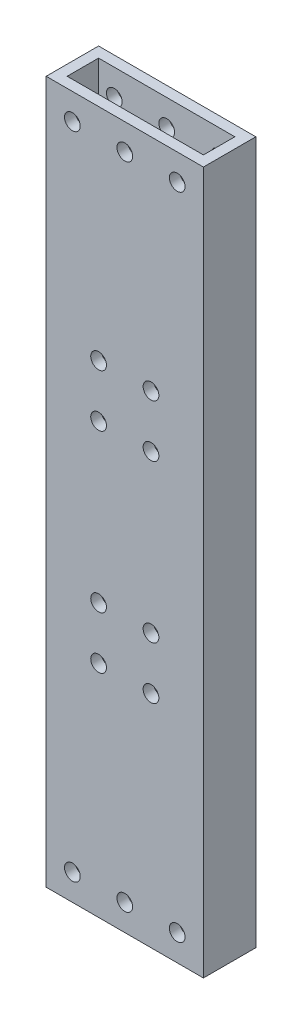
ISO-10303-21;
HEADER;
FILE_DESCRIPTION(('STEP AP214'),'2;1');
FILE_NAME('part.step','',(''),(''),'','','');
FILE_SCHEMA(('AUTOMOTIVE_DESIGN { 1 0 10303 214 1 1 1 1 }'));
ENDSEC;
DATA;
#1=APPLICATION_CONTEXT('core data for automotive mechanical design processes');
#2=APPLICATION_PROTOCOL_DEFINITION('international standard','automotive_design',2000,#1);
#3=PRODUCT_CONTEXT('',#1,'mechanical');
#4=PRODUCT('Part','Part','',(#3));
#5=PRODUCT_RELATED_PRODUCT_CATEGORY('part','',(#4));
#6=PRODUCT_DEFINITION_FORMATION('','',#4);
#7=PRODUCT_DEFINITION_CONTEXT('part definition',#1,'design');
#8=PRODUCT_DEFINITION('design','',#6,#7);
#9=PRODUCT_DEFINITION_SHAPE('','',#8);
#10=(LENGTH_UNIT() NAMED_UNIT(*) SI_UNIT(.MILLI.,.METRE.));
#11=(NAMED_UNIT(*) PLANE_ANGLE_UNIT() SI_UNIT($,.RADIAN.));
#12=(NAMED_UNIT(*) SI_UNIT($,.STERADIAN.) SOLID_ANGLE_UNIT());
#13=UNCERTAINTY_MEASURE_WITH_UNIT(LENGTH_MEASURE(1.E-05),#10,'distance_accuracy_value','');
#14=(GEOMETRIC_REPRESENTATION_CONTEXT(3) GLOBAL_UNCERTAINTY_ASSIGNED_CONTEXT((#13)) GLOBAL_UNIT_ASSIGNED_CONTEXT((#10,
#11,#12)) REPRESENTATION_CONTEXT('',''));
#15=CARTESIAN_POINT('',(0.,0.,0.));
#16=DIRECTION('',(0.,0.,1.));
#17=DIRECTION('',(1.,0.,0.));
#18=AXIS2_PLACEMENT_3D('',#15,#16,#17);
#19=CARTESIAN_POINT('',(0.,67.,0.));
#20=DIRECTION('',(0.,1.,0.));
#21=DIRECTION('',(0.,0.,1.));
#22=AXIS2_PLACEMENT_3D('',#19,#20,#21);
#23=PLANE('',#22);
#24=DIRECTION('',(0.,0.,-1.));
#25=VECTOR('',#24,1.);
#26=CARTESIAN_POINT('',(15.,67.,-5.));
#27=LINE('',#26,#25);
#28=CARTESIAN_POINT('',(15.,67.,5.));
#29=VERTEX_POINT('',#28);
#30=CARTESIAN_POINT('',(15.,67.,-5.));
#31=VERTEX_POINT('',#30);
#32=EDGE_CURVE('E140',#29,#31,#27,.T.);
#33=ORIENTED_EDGE('',*,*,#32,.T.);
#34=DIRECTION('',(-1.,0.,0.));
#35=VECTOR('',#34,1.);
#36=CARTESIAN_POINT('',(-15.,67.,-5.));
#37=LINE('',#36,#35);
#38=CARTESIAN_POINT('',(-15.,67.,-5.));
#39=VERTEX_POINT('',#38);
#40=EDGE_CURVE('E143',#31,#39,#37,.T.);
#41=ORIENTED_EDGE('',*,*,#40,.T.);
#42=DIRECTION('',(0.,0.,1.));
#43=VECTOR('',#42,1.);
#44=CARTESIAN_POINT('',(-15.,67.,-5.));
#45=LINE('',#44,#43);
#46=CARTESIAN_POINT('',(-15.,67.,5.));
#47=VERTEX_POINT('',#46);
#48=EDGE_CURVE('E146',#39,#47,#45,.T.);
#49=ORIENTED_EDGE('',*,*,#48,.T.);
#50=DIRECTION('',(1.,0.,0.));
#51=VECTOR('',#50,1.);
#52=CARTESIAN_POINT('',(-15.,67.,5.));
#53=LINE('',#52,#51);
#54=EDGE_CURVE('E148',#47,#29,#53,.T.);
#55=ORIENTED_EDGE('',*,*,#54,.T.);
#56=EDGE_LOOP('',(#33,#41,#49,#55));
#57=FACE_BOUND('',#56,.T.);
#58=DIRECTION('',(-1.,0.,0.));
#59=VECTOR('',#58,1.);
#60=CARTESIAN_POINT('',(-13.,67.,-3.));
#61=LINE('',#60,#59);
#62=CARTESIAN_POINT('',(13.,67.,-3.));
#63=VERTEX_POINT('',#62);
#64=CARTESIAN_POINT('',(-13.,67.,-3.));
#65=VERTEX_POINT('',#64);
#66=EDGE_CURVE('E110',#63,#65,#61,.T.);
#67=ORIENTED_EDGE('',*,*,#66,.F.);
#68=DIRECTION('',(0.,0.,-1.));
#69=VECTOR('',#68,1.);
#70=CARTESIAN_POINT('',(13.,67.,-3.));
#71=LINE('',#70,#69);
#72=CARTESIAN_POINT('',(13.,67.,3.));
#73=VERTEX_POINT('',#72);
#74=EDGE_CURVE('E102',#73,#63,#71,.T.);
#75=ORIENTED_EDGE('',*,*,#74,.F.);
#76=DIRECTION('',(1.,0.,0.));
#77=VECTOR('',#76,1.);
#78=CARTESIAN_POINT('',(-13.,67.,3.));
#79=LINE('',#78,#77);
#80=CARTESIAN_POINT('',(-13.,67.,3.));
#81=VERTEX_POINT('',#80);
#82=EDGE_CURVE('E124',#81,#73,#79,.T.);
#83=ORIENTED_EDGE('',*,*,#82,.F.);
#84=DIRECTION('',(0.,0.,1.));
#85=VECTOR('',#84,1.);
#86=CARTESIAN_POINT('',(-13.,67.,-3.));
#87=LINE('',#86,#85);
#88=EDGE_CURVE('E122',#65,#81,#87,.T.);
#89=ORIENTED_EDGE('',*,*,#88,.F.);
#90=EDGE_LOOP('',(#67,#75,#83,#89));
#91=FACE_BOUND('',#90,.T.);
#92=ADVANCED_FACE('F35',(#57,#91),#23,.T.);
#93=CARTESIAN_POINT('',(0.,-67.,0.));
#94=DIRECTION('',(0.,1.,0.));
#95=DIRECTION('',(0.,0.,1.));
#96=AXIS2_PLACEMENT_3D('',#93,#94,#95);
#97=PLANE('',#96);
#98=DIRECTION('',(0.,0.,-1.));
#99=VECTOR('',#98,1.);
#100=CARTESIAN_POINT('',(15.,-67.,-5.));
#101=LINE('',#100,#99);
#102=CARTESIAN_POINT('',(15.,-67.,5.));
#103=VERTEX_POINT('',#102);
#104=CARTESIAN_POINT('',(15.,-67.,-5.));
#105=VERTEX_POINT('',#104);
#106=EDGE_CURVE('E118',#103,#105,#101,.T.);
#107=ORIENTED_EDGE('',*,*,#106,.F.);
#108=DIRECTION('',(1.,0.,0.));
#109=VECTOR('',#108,1.);
#110=CARTESIAN_POINT('',(-15.,-67.,5.));
#111=LINE('',#110,#109);
#112=CARTESIAN_POINT('',(-15.,-67.,5.));
#113=VERTEX_POINT('',#112);
#114=EDGE_CURVE('E144',#113,#103,#111,.T.);
#115=ORIENTED_EDGE('',*,*,#114,.F.);
#116=DIRECTION('',(0.,0.,1.));
#117=VECTOR('',#116,1.);
#118=CARTESIAN_POINT('',(-15.,-67.,-5.));
#119=LINE('',#118,#117);
#120=CARTESIAN_POINT('',(-15.,-67.,-5.));
#121=VERTEX_POINT('',#120);
#122=EDGE_CURVE('E155',#121,#113,#119,.T.);
#123=ORIENTED_EDGE('',*,*,#122,.F.);
#124=DIRECTION('',(-1.,0.,0.));
#125=VECTOR('',#124,1.);
#126=CARTESIAN_POINT('',(-15.,-67.,-5.));
#127=LINE('',#126,#125);
#128=EDGE_CURVE('E153',#105,#121,#127,.T.);
#129=ORIENTED_EDGE('',*,*,#128,.F.);
#130=EDGE_LOOP('',(#107,#115,#123,#129));
#131=FACE_BOUND('',#130,.T.);
#132=DIRECTION('',(0.,0.,-1.));
#133=VECTOR('',#132,1.);
#134=CARTESIAN_POINT('',(13.,-67.,-3.));
#135=LINE('',#134,#133);
#136=CARTESIAN_POINT('',(13.,-67.,3.));
#137=VERTEX_POINT('',#136);
#138=CARTESIAN_POINT('',(13.,-67.,-3.));
#139=VERTEX_POINT('',#138);
#140=EDGE_CURVE('E60',#137,#139,#135,.T.);
#141=ORIENTED_EDGE('',*,*,#140,.T.);
#142=DIRECTION('',(-1.,0.,0.));
#143=VECTOR('',#142,1.);
#144=CARTESIAN_POINT('',(-13.,-67.,-3.));
#145=LINE('',#144,#143);
#146=CARTESIAN_POINT('',(-13.,-67.,-3.));
#147=VERTEX_POINT('',#146);
#148=EDGE_CURVE('E117',#139,#147,#145,.T.);
#149=ORIENTED_EDGE('',*,*,#148,.T.);
#150=DIRECTION('',(0.,0.,1.));
#151=VECTOR('',#150,1.);
#152=CARTESIAN_POINT('',(-13.,-67.,-3.));
#153=LINE('',#152,#151);
#154=CARTESIAN_POINT('',(-13.,-67.,3.));
#155=VERTEX_POINT('',#154);
#156=EDGE_CURVE('E132',#147,#155,#153,.T.);
#157=ORIENTED_EDGE('',*,*,#156,.T.);
#158=DIRECTION('',(1.,0.,0.));
#159=VECTOR('',#158,1.);
#160=CARTESIAN_POINT('',(-13.,-67.,3.));
#161=LINE('',#160,#159);
#162=EDGE_CURVE('E111',#155,#137,#161,.T.);
#163=ORIENTED_EDGE('',*,*,#162,.T.);
#164=EDGE_LOOP('',(#141,#149,#157,#163));
#165=FACE_BOUND('',#164,.T.);
#166=ADVANCED_FACE('F267',(#131,#165),#97,.F.);
#167=CARTESIAN_POINT('',(15.,67.,-5.));
#168=DIRECTION('',(-1.,0.,0.));
#169=DIRECTION('',(0.,0.,1.));
#170=AXIS2_PLACEMENT_3D('',#167,#168,#169);
#171=PLANE('',#170);
#172=ORIENTED_EDGE('',*,*,#106,.T.);
#173=DIRECTION('',(0.,-1.,0.));
#174=VECTOR('',#173,1.);
#175=CARTESIAN_POINT('',(15.,67.,-5.));
#176=LINE('',#175,#174);
#177=EDGE_CURVE('E11',#31,#105,#176,.T.);
#178=ORIENTED_EDGE('',*,*,#177,.F.);
#179=ORIENTED_EDGE('',*,*,#32,.F.);
#180=DIRECTION('',(0.,-1.,0.));
#181=VECTOR('',#180,1.);
#182=CARTESIAN_POINT('',(15.,67.,5.));
#183=LINE('',#182,#181);
#184=EDGE_CURVE('E150',#29,#103,#183,.T.);
#185=ORIENTED_EDGE('',*,*,#184,.T.);
#186=EDGE_LOOP('',(#172,#178,#179,#185));
#187=FACE_BOUND('',#186,.T.);
#188=ADVANCED_FACE('F37',(#187),#171,.F.);
#189=CARTESIAN_POINT('',(-15.,67.,-5.));
#190=DIRECTION('',(0.,0.,1.));
#191=DIRECTION('',(1.,0.,0.));
#192=AXIS2_PLACEMENT_3D('',#189,#190,#191);
#193=PLANE('',#192);
#194=CARTESIAN_POINT('',(10.,-62.,-5.));
#195=DIRECTION('',(0.,0.,1.));
#196=DIRECTION('',(-1.,0.,0.));
#197=AXIS2_PLACEMENT_3D('',#194,#195,#196);
#198=CIRCLE('',#197,1.5);
#199=CARTESIAN_POINT('',(8.5,-62.,-5.));
#200=VERTEX_POINT('',#199);
#201=EDGE_CURVE('E303',#200,#200,#198,.T.);
#202=ORIENTED_EDGE('',*,*,#201,.T.);
#203=EDGE_LOOP('',(#202));
#204=FACE_BOUND('',#203,.T.);
#205=CARTESIAN_POINT('',(0.,-62.,-5.));
#206=DIRECTION('',(0.,0.,1.));
#207=DIRECTION('',(-1.,0.,0.));
#208=AXIS2_PLACEMENT_3D('',#205,#206,#207);
#209=CIRCLE('',#208,1.5);
#210=CARTESIAN_POINT('',(-1.5,-62.,-5.));
#211=VERTEX_POINT('',#210);
#212=EDGE_CURVE('E307',#211,#211,#209,.T.);
#213=ORIENTED_EDGE('',*,*,#212,.T.);
#214=EDGE_LOOP('',(#213));
#215=FACE_BOUND('',#214,.T.);
#216=CARTESIAN_POINT('',(-10.,-62.,-5.));
#217=DIRECTION('',(0.,0.,1.));
#218=DIRECTION('',(-1.,0.,0.));
#219=AXIS2_PLACEMENT_3D('',#216,#217,#218);
#220=CIRCLE('',#219,1.5);
#221=CARTESIAN_POINT('',(-11.5,-62.,-5.));
#222=VERTEX_POINT('',#221);
#223=EDGE_CURVE('E311',#222,#222,#220,.T.);
#224=ORIENTED_EDGE('',*,*,#223,.T.);
#225=EDGE_LOOP('',(#224));
#226=FACE_BOUND('',#225,.T.);
#227=CARTESIAN_POINT('',(-5.,-24.9999999999997,-5.));
#228=DIRECTION('',(0.,0.,1.));
#229=DIRECTION('',(-1.,0.,0.));
#230=AXIS2_PLACEMENT_3D('',#227,#228,#229);
#231=CIRCLE('',#230,1.5);
#232=CARTESIAN_POINT('',(-6.5,-24.9999999999997,-5.));
#233=VERTEX_POINT('',#232);
#234=EDGE_CURVE('E315',#233,#233,#231,.T.);
#235=ORIENTED_EDGE('',*,*,#234,.T.);
#236=EDGE_LOOP('',(#235));
#237=FACE_BOUND('',#236,.T.);
#238=CARTESIAN_POINT('',(5.,-24.9999999999997,-5.));
#239=DIRECTION('',(0.,0.,1.));
#240=DIRECTION('',(-1.,0.,0.));
#241=AXIS2_PLACEMENT_3D('',#238,#239,#240);
#242=CIRCLE('',#241,1.5);
#243=CARTESIAN_POINT('',(3.5,-24.9999999999997,-5.));
#244=VERTEX_POINT('',#243);
#245=EDGE_CURVE('E319',#244,#244,#242,.T.);
#246=ORIENTED_EDGE('',*,*,#245,.T.);
#247=EDGE_LOOP('',(#246));
#248=FACE_BOUND('',#247,.T.);
#249=CARTESIAN_POINT('',(0.,62.,-5.));
#250=DIRECTION('',(0.,0.,1.));
#251=DIRECTION('',(1.,0.,0.));
#252=AXIS2_PLACEMENT_3D('',#249,#250,#251);
#253=CIRCLE('',#252,1.5);
#254=CARTESIAN_POINT('',(1.5,62.,-5.));
#255=VERTEX_POINT('',#254);
#256=EDGE_CURVE('E323',#255,#255,#253,.T.);
#257=ORIENTED_EDGE('',*,*,#256,.T.);
#258=EDGE_LOOP('',(#257));
#259=FACE_BOUND('',#258,.T.);
#260=CARTESIAN_POINT('',(10.,62.,-5.));
#261=DIRECTION('',(0.,0.,1.));
#262=DIRECTION('',(1.,0.,0.));
#263=AXIS2_PLACEMENT_3D('',#260,#261,#262);
#264=CIRCLE('',#263,1.5);
#265=CARTESIAN_POINT('',(11.5,62.,-5.));
#266=VERTEX_POINT('',#265);
#267=EDGE_CURVE('E327',#266,#266,#264,.T.);
#268=ORIENTED_EDGE('',*,*,#267,.T.);
#269=EDGE_LOOP('',(#268));
#270=FACE_BOUND('',#269,.T.);
#271=CARTESIAN_POINT('',(-5.,24.9999999999997,-5.));
#272=DIRECTION('',(0.,0.,1.));
#273=DIRECTION('',(1.,0.,0.));
#274=AXIS2_PLACEMENT_3D('',#271,#272,#273);
#275=CIRCLE('',#274,1.5);
#276=CARTESIAN_POINT('',(-3.5,24.9999999999997,-5.));
#277=VERTEX_POINT('',#276);
#278=EDGE_CURVE('E331',#277,#277,#275,.T.);
#279=ORIENTED_EDGE('',*,*,#278,.T.);
#280=EDGE_LOOP('',(#279));
#281=FACE_BOUND('',#280,.T.);
#282=CARTESIAN_POINT('',(-5.,14.9999999999997,-5.));
#283=DIRECTION('',(0.,0.,1.));
#284=DIRECTION('',(1.,0.,0.));
#285=AXIS2_PLACEMENT_3D('',#282,#283,#284);
#286=CIRCLE('',#285,1.5);
#287=CARTESIAN_POINT('',(-3.5,14.9999999999997,-5.));
#288=VERTEX_POINT('',#287);
#289=EDGE_CURVE('E335',#288,#288,#286,.T.);
#290=ORIENTED_EDGE('',*,*,#289,.T.);
#291=EDGE_LOOP('',(#290));
#292=FACE_BOUND('',#291,.T.);
#293=CARTESIAN_POINT('',(5.,14.9999999999997,-5.));
#294=DIRECTION('',(0.,0.,1.));
#295=DIRECTION('',(1.,0.,0.));
#296=AXIS2_PLACEMENT_3D('',#293,#294,#295);
#297=CIRCLE('',#296,1.5);
#298=CARTESIAN_POINT('',(6.5,14.9999999999997,-5.));
#299=VERTEX_POINT('',#298);
#300=EDGE_CURVE('E339',#299,#299,#297,.T.);
#301=ORIENTED_EDGE('',*,*,#300,.T.);
#302=EDGE_LOOP('',(#301));
#303=FACE_BOUND('',#302,.T.);
#304=CARTESIAN_POINT('',(5.,24.9999999999997,-5.));
#305=DIRECTION('',(0.,0.,1.));
#306=DIRECTION('',(1.,0.,0.));
#307=AXIS2_PLACEMENT_3D('',#304,#305,#306);
#308=CIRCLE('',#307,1.5);
#309=CARTESIAN_POINT('',(6.5,24.9999999999997,-5.));
#310=VERTEX_POINT('',#309);
#311=EDGE_CURVE('E343',#310,#310,#308,.T.);
#312=ORIENTED_EDGE('',*,*,#311,.T.);
#313=EDGE_LOOP('',(#312));
#314=FACE_BOUND('',#313,.T.);
#315=CARTESIAN_POINT('',(-5.,-14.9999999999997,-5.));
#316=DIRECTION('',(0.,0.,1.));
#317=DIRECTION('',(-1.,0.,0.));
#318=AXIS2_PLACEMENT_3D('',#315,#316,#317);
#319=CIRCLE('',#318,1.5);
#320=CARTESIAN_POINT('',(-6.5,-14.9999999999997,-5.));
#321=VERTEX_POINT('',#320);
#322=EDGE_CURVE('E347',#321,#321,#319,.T.);
#323=ORIENTED_EDGE('',*,*,#322,.T.);
#324=EDGE_LOOP('',(#323));
#325=FACE_BOUND('',#324,.T.);
#326=CARTESIAN_POINT('',(5.,-14.9999999999997,-5.));
#327=DIRECTION('',(0.,0.,1.));
#328=DIRECTION('',(-1.,0.,0.));
#329=AXIS2_PLACEMENT_3D('',#326,#327,#328);
#330=CIRCLE('',#329,1.5);
#331=CARTESIAN_POINT('',(3.5,-14.9999999999997,-5.));
#332=VERTEX_POINT('',#331);
#333=EDGE_CURVE('E351',#332,#332,#330,.T.);
#334=ORIENTED_EDGE('',*,*,#333,.T.);
#335=EDGE_LOOP('',(#334));
#336=FACE_BOUND('',#335,.T.);
#337=CARTESIAN_POINT('',(-10.,62.,-5.));
#338=DIRECTION('',(0.,0.,1.));
#339=DIRECTION('',(1.,0.,0.));
#340=AXIS2_PLACEMENT_3D('',#337,#338,#339);
#341=CIRCLE('',#340,1.5);
#342=CARTESIAN_POINT('',(-8.5,62.,-5.));
#343=VERTEX_POINT('',#342);
#344=EDGE_CURVE('E169',#343,#343,#341,.T.);
#345=ORIENTED_EDGE('',*,*,#344,.T.);
#346=EDGE_LOOP('',(#345));
#347=FACE_BOUND('',#346,.T.);
#348=ORIENTED_EDGE('',*,*,#128,.T.);
#349=DIRECTION('',(0.,-1.,0.));
#350=VECTOR('',#349,1.);
#351=CARTESIAN_POINT('',(-15.,67.,-5.));
#352=LINE('',#351,#350);
#353=EDGE_CURVE('E44',#39,#121,#352,.T.);
#354=ORIENTED_EDGE('',*,*,#353,.F.);
#355=ORIENTED_EDGE('',*,*,#40,.F.);
#356=ORIENTED_EDGE('',*,*,#177,.T.);
#357=EDGE_LOOP('',(#348,#354,#355,#356));
#358=FACE_BOUND('',#357,.T.);
#359=ADVANCED_FACE('F292',(#204,#215,#226,#237,#248,#259,#270,#281,#292,#303,#314,#325,#336,
#347,#358),#193,.F.);
#360=CARTESIAN_POINT('',(-15.,67.,-5.));
#361=DIRECTION('',(1.,0.,0.));
#362=DIRECTION('',(0.,0.,-1.));
#363=AXIS2_PLACEMENT_3D('',#360,#361,#362);
#364=PLANE('',#363);
#365=ORIENTED_EDGE('',*,*,#122,.T.);
#366=DIRECTION('',(0.,-1.,0.));
#367=VECTOR('',#366,1.);
#368=CARTESIAN_POINT('',(-15.,67.,5.));
#369=LINE('',#368,#367);
#370=EDGE_CURVE('E160',#47,#113,#369,.T.);
#371=ORIENTED_EDGE('',*,*,#370,.F.);
#372=ORIENTED_EDGE('',*,*,#48,.F.);
#373=ORIENTED_EDGE('',*,*,#353,.T.);
#374=EDGE_LOOP('',(#365,#371,#372,#373));
#375=FACE_BOUND('',#374,.T.);
#376=ADVANCED_FACE('F289',(#375),#364,.F.);
#377=CARTESIAN_POINT('',(-15.,67.,5.));
#378=DIRECTION('',(0.,0.,-1.));
#379=DIRECTION('',(-1.,0.,0.));
#380=AXIS2_PLACEMENT_3D('',#377,#378,#379);
#381=PLANE('',#380);
#382=CARTESIAN_POINT('',(10.,-62.,5.));
#383=DIRECTION('',(0.,0.,1.));
#384=DIRECTION('',(-1.,0.,0.));
#385=AXIS2_PLACEMENT_3D('',#382,#383,#384);
#386=CIRCLE('',#385,1.5);
#387=CARTESIAN_POINT('',(8.5,-62.,5.));
#388=VERTEX_POINT('',#387);
#389=EDGE_CURVE('E372',#388,#388,#386,.T.);
#390=ORIENTED_EDGE('',*,*,#389,.F.);
#391=EDGE_LOOP('',(#390));
#392=FACE_BOUND('',#391,.T.);
#393=CARTESIAN_POINT('',(0.,-62.,5.));
#394=DIRECTION('',(0.,0.,1.));
#395=DIRECTION('',(-1.,0.,0.));
#396=AXIS2_PLACEMENT_3D('',#393,#394,#395);
#397=CIRCLE('',#396,1.5);
#398=CARTESIAN_POINT('',(-1.5,-62.,5.));
#399=VERTEX_POINT('',#398);
#400=EDGE_CURVE('E500',#399,#399,#397,.T.);
#401=ORIENTED_EDGE('',*,*,#400,.F.);
#402=EDGE_LOOP('',(#401));
#403=FACE_BOUND('',#402,.T.);
#404=CARTESIAN_POINT('',(-10.,-62.,5.));
#405=DIRECTION('',(0.,0.,1.));
#406=DIRECTION('',(-1.,0.,0.));
#407=AXIS2_PLACEMENT_3D('',#404,#405,#406);
#408=CIRCLE('',#407,1.5);
#409=CARTESIAN_POINT('',(-11.5,-62.,5.));
#410=VERTEX_POINT('',#409);
#411=EDGE_CURVE('E499',#410,#410,#408,.T.);
#412=ORIENTED_EDGE('',*,*,#411,.F.);
#413=EDGE_LOOP('',(#412));
#414=FACE_BOUND('',#413,.T.);
#415=CARTESIAN_POINT('',(-5.,-24.9999999999997,5.));
#416=DIRECTION('',(0.,0.,1.));
#417=DIRECTION('',(-1.,0.,0.));
#418=AXIS2_PLACEMENT_3D('',#415,#416,#417);
#419=CIRCLE('',#418,1.5);
#420=CARTESIAN_POINT('',(-6.5,-24.9999999999997,5.));
#421=VERTEX_POINT('',#420);
#422=EDGE_CURVE('E517',#421,#421,#419,.T.);
#423=ORIENTED_EDGE('',*,*,#422,.F.);
#424=EDGE_LOOP('',(#423));
#425=FACE_BOUND('',#424,.T.);
#426=CARTESIAN_POINT('',(5.,-24.9999999999997,5.));
#427=DIRECTION('',(0.,0.,1.));
#428=DIRECTION('',(-1.,0.,0.));
#429=AXIS2_PLACEMENT_3D('',#426,#427,#428);
#430=CIRCLE('',#429,1.5);
#431=CARTESIAN_POINT('',(3.5,-24.9999999999997,5.));
#432=VERTEX_POINT('',#431);
#433=EDGE_CURVE('E521',#432,#432,#430,.T.);
#434=ORIENTED_EDGE('',*,*,#433,.F.);
#435=EDGE_LOOP('',(#434));
#436=FACE_BOUND('',#435,.T.);
#437=CARTESIAN_POINT('',(0.,62.,5.));
#438=DIRECTION('',(0.,0.,1.));
#439=DIRECTION('',(1.,0.,0.));
#440=AXIS2_PLACEMENT_3D('',#437,#438,#439);
#441=CIRCLE('',#440,1.5);
#442=CARTESIAN_POINT('',(1.5,62.,5.));
#443=VERTEX_POINT('',#442);
#444=EDGE_CURVE('E525',#443,#443,#441,.T.);
#445=ORIENTED_EDGE('',*,*,#444,.F.);
#446=EDGE_LOOP('',(#445));
#447=FACE_BOUND('',#446,.T.);
#448=CARTESIAN_POINT('',(10.,62.,5.));
#449=DIRECTION('',(0.,0.,1.));
#450=DIRECTION('',(1.,0.,0.));
#451=AXIS2_PLACEMENT_3D('',#448,#449,#450);
#452=CIRCLE('',#451,1.5);
#453=CARTESIAN_POINT('',(11.5,62.,5.));
#454=VERTEX_POINT('',#453);
#455=EDGE_CURVE('E529',#454,#454,#452,.T.);
#456=ORIENTED_EDGE('',*,*,#455,.F.);
#457=EDGE_LOOP('',(#456));
#458=FACE_BOUND('',#457,.T.);
#459=CARTESIAN_POINT('',(-5.,24.9999999999997,5.));
#460=DIRECTION('',(0.,0.,1.));
#461=DIRECTION('',(1.,0.,0.));
#462=AXIS2_PLACEMENT_3D('',#459,#460,#461);
#463=CIRCLE('',#462,1.5);
#464=CARTESIAN_POINT('',(-3.5,24.9999999999997,5.));
#465=VERTEX_POINT('',#464);
#466=EDGE_CURVE('E533',#465,#465,#463,.T.);
#467=ORIENTED_EDGE('',*,*,#466,.F.);
#468=EDGE_LOOP('',(#467));
#469=FACE_BOUND('',#468,.T.);
#470=CARTESIAN_POINT('',(-5.,14.9999999999997,5.));
#471=DIRECTION('',(0.,0.,1.));
#472=DIRECTION('',(1.,0.,0.));
#473=AXIS2_PLACEMENT_3D('',#470,#471,#472);
#474=CIRCLE('',#473,1.5);
#475=CARTESIAN_POINT('',(-3.5,14.9999999999997,5.));
#476=VERTEX_POINT('',#475);
#477=EDGE_CURVE('E537',#476,#476,#474,.T.);
#478=ORIENTED_EDGE('',*,*,#477,.F.);
#479=EDGE_LOOP('',(#478));
#480=FACE_BOUND('',#479,.T.);
#481=CARTESIAN_POINT('',(5.,14.9999999999997,5.));
#482=DIRECTION('',(0.,0.,1.));
#483=DIRECTION('',(1.,0.,0.));
#484=AXIS2_PLACEMENT_3D('',#481,#482,#483);
#485=CIRCLE('',#484,1.5);
#486=CARTESIAN_POINT('',(6.5,14.9999999999997,5.));
#487=VERTEX_POINT('',#486);
#488=EDGE_CURVE('E541',#487,#487,#485,.T.);
#489=ORIENTED_EDGE('',*,*,#488,.F.);
#490=EDGE_LOOP('',(#489));
#491=FACE_BOUND('',#490,.T.);
#492=CARTESIAN_POINT('',(5.,24.9999999999997,5.));
#493=DIRECTION('',(0.,0.,1.));
#494=DIRECTION('',(1.,0.,0.));
#495=AXIS2_PLACEMENT_3D('',#492,#493,#494);
#496=CIRCLE('',#495,1.5);
#497=CARTESIAN_POINT('',(6.5,24.9999999999997,5.));
#498=VERTEX_POINT('',#497);
#499=EDGE_CURVE('E545',#498,#498,#496,.T.);
#500=ORIENTED_EDGE('',*,*,#499,.F.);
#501=EDGE_LOOP('',(#500));
#502=FACE_BOUND('',#501,.T.);
#503=CARTESIAN_POINT('',(-5.,-14.9999999999997,5.));
#504=DIRECTION('',(0.,0.,1.));
#505=DIRECTION('',(-1.,0.,0.));
#506=AXIS2_PLACEMENT_3D('',#503,#504,#505);
#507=CIRCLE('',#506,1.5);
#508=CARTESIAN_POINT('',(-6.5,-14.9999999999997,5.));
#509=VERTEX_POINT('',#508);
#510=EDGE_CURVE('E549',#509,#509,#507,.T.);
#511=ORIENTED_EDGE('',*,*,#510,.F.);
#512=EDGE_LOOP('',(#511));
#513=FACE_BOUND('',#512,.T.);
#514=CARTESIAN_POINT('',(5.,-14.9999999999997,5.));
#515=DIRECTION('',(0.,0.,1.));
#516=DIRECTION('',(-1.,0.,0.));
#517=AXIS2_PLACEMENT_3D('',#514,#515,#516);
#518=CIRCLE('',#517,1.5);
#519=CARTESIAN_POINT('',(3.5,-14.9999999999997,5.));
#520=VERTEX_POINT('',#519);
#521=EDGE_CURVE('E552',#520,#520,#518,.T.);
#522=ORIENTED_EDGE('',*,*,#521,.F.);
#523=EDGE_LOOP('',(#522));
#524=FACE_BOUND('',#523,.T.);
#525=CARTESIAN_POINT('',(-10.,62.,5.));
#526=DIRECTION('',(0.,0.,1.));
#527=DIRECTION('',(1.,0.,0.));
#528=AXIS2_PLACEMENT_3D('',#525,#526,#527);
#529=CIRCLE('',#528,1.5);
#530=CARTESIAN_POINT('',(-8.5,62.,5.));
#531=VERTEX_POINT('',#530);
#532=EDGE_CURVE('E367',#531,#531,#529,.T.);
#533=ORIENTED_EDGE('',*,*,#532,.F.);
#534=EDGE_LOOP('',(#533));
#535=FACE_BOUND('',#534,.T.);
#536=ORIENTED_EDGE('',*,*,#114,.T.);
#537=ORIENTED_EDGE('',*,*,#184,.F.);
#538=ORIENTED_EDGE('',*,*,#54,.F.);
#539=ORIENTED_EDGE('',*,*,#370,.T.);
#540=EDGE_LOOP('',(#536,#537,#538,#539));
#541=FACE_BOUND('',#540,.T.);
#542=ADVANCED_FACE('F286',(#392,#403,#414,#425,#436,#447,#458,#469,#480,#491,#502,#513,#524,
#535,#541),#381,.F.);
#543=CARTESIAN_POINT('',(13.,67.,-3.));
#544=DIRECTION('',(-1.,0.,0.));
#545=DIRECTION('',(0.,0.,1.));
#546=AXIS2_PLACEMENT_3D('',#543,#544,#545);
#547=PLANE('',#546);
#548=ORIENTED_EDGE('',*,*,#140,.F.);
#549=DIRECTION('',(0.,-1.,0.));
#550=VECTOR('',#549,1.);
#551=CARTESIAN_POINT('',(13.,67.,3.));
#552=LINE('',#551,#550);
#553=EDGE_CURVE('E106',#73,#137,#552,.T.);
#554=ORIENTED_EDGE('',*,*,#553,.F.);
#555=ORIENTED_EDGE('',*,*,#74,.T.);
#556=DIRECTION('',(0.,-1.,0.));
#557=VECTOR('',#556,1.);
#558=CARTESIAN_POINT('',(13.,67.,-3.));
#559=LINE('',#558,#557);
#560=EDGE_CURVE('E105',#63,#139,#559,.T.);
#561=ORIENTED_EDGE('',*,*,#560,.T.);
#562=EDGE_LOOP('',(#548,#554,#555,#561));
#563=FACE_BOUND('',#562,.T.);
#564=ADVANCED_FACE('F104',(#563),#547,.T.);
#565=CARTESIAN_POINT('',(-13.,67.,-3.));
#566=DIRECTION('',(0.,0.,1.));
#567=DIRECTION('',(1.,0.,0.));
#568=AXIS2_PLACEMENT_3D('',#565,#566,#567);
#569=PLANE('',#568);
#570=CARTESIAN_POINT('',(10.,-62.,-3.));
#571=DIRECTION('',(0.,0.,1.));
#572=DIRECTION('',(1.,0.,0.));
#573=AXIS2_PLACEMENT_3D('',#570,#571,#572);
#574=CIRCLE('',#573,1.5);
#575=CARTESIAN_POINT('',(11.5,-62.,-3.));
#576=VERTEX_POINT('',#575);
#577=EDGE_CURVE('E130',#576,#576,#574,.T.);
#578=ORIENTED_EDGE('',*,*,#577,.F.);
#579=EDGE_LOOP('',(#578));
#580=FACE_BOUND('',#579,.T.);
#581=CARTESIAN_POINT('',(0.,-62.,-3.));
#582=DIRECTION('',(0.,0.,1.));
#583=DIRECTION('',(1.,0.,0.));
#584=AXIS2_PLACEMENT_3D('',#581,#582,#583);
#585=CIRCLE('',#584,1.5);
#586=CARTESIAN_POINT('',(1.5,-62.,-3.));
#587=VERTEX_POINT('',#586);
#588=EDGE_CURVE('E215',#587,#587,#585,.T.);
#589=ORIENTED_EDGE('',*,*,#588,.F.);
#590=EDGE_LOOP('',(#589));
#591=FACE_BOUND('',#590,.T.);
#592=CARTESIAN_POINT('',(-10.,-62.,-3.));
#593=DIRECTION('',(0.,0.,1.));
#594=DIRECTION('',(1.,0.,0.));
#595=AXIS2_PLACEMENT_3D('',#592,#593,#594);
#596=CIRCLE('',#595,1.5);
#597=CARTESIAN_POINT('',(-8.5,-62.,-3.));
#598=VERTEX_POINT('',#597);
#599=EDGE_CURVE('E212',#598,#598,#596,.T.);
#600=ORIENTED_EDGE('',*,*,#599,.F.);
#601=EDGE_LOOP('',(#600));
#602=FACE_BOUND('',#601,.T.);
#603=CARTESIAN_POINT('',(-5.,-24.9999999999997,-3.));
#604=DIRECTION('',(0.,0.,1.));
#605=DIRECTION('',(1.,0.,0.));
#606=AXIS2_PLACEMENT_3D('',#603,#604,#605);
#607=CIRCLE('',#606,1.5);
#608=CARTESIAN_POINT('',(-3.5,-24.9999999999997,-3.));
#609=VERTEX_POINT('',#608);
#610=EDGE_CURVE('E209',#609,#609,#607,.T.);
#611=ORIENTED_EDGE('',*,*,#610,.F.);
#612=EDGE_LOOP('',(#611));
#613=FACE_BOUND('',#612,.T.);
#614=CARTESIAN_POINT('',(5.,-24.9999999999997,-3.));
#615=DIRECTION('',(0.,0.,1.));
#616=DIRECTION('',(1.,0.,0.));
#617=AXIS2_PLACEMENT_3D('',#614,#615,#616);
#618=CIRCLE('',#617,1.5);
#619=CARTESIAN_POINT('',(6.5,-24.9999999999997,-3.));
#620=VERTEX_POINT('',#619);
#621=EDGE_CURVE('E205',#620,#620,#618,.T.);
#622=ORIENTED_EDGE('',*,*,#621,.F.);
#623=EDGE_LOOP('',(#622));
#624=FACE_BOUND('',#623,.T.);
#625=CARTESIAN_POINT('',(0.,62.,-3.));
#626=DIRECTION('',(0.,0.,1.));
#627=DIRECTION('',(1.,0.,0.));
#628=AXIS2_PLACEMENT_3D('',#625,#626,#627);
#629=CIRCLE('',#628,1.5);
#630=CARTESIAN_POINT('',(1.5,62.,-3.));
#631=VERTEX_POINT('',#630);
#632=EDGE_CURVE('E201',#631,#631,#629,.T.);
#633=ORIENTED_EDGE('',*,*,#632,.F.);
#634=EDGE_LOOP('',(#633));
#635=FACE_BOUND('',#634,.T.);
#636=CARTESIAN_POINT('',(10.,62.,-3.));
#637=DIRECTION('',(0.,0.,1.));
#638=DIRECTION('',(1.,0.,0.));
#639=AXIS2_PLACEMENT_3D('',#636,#637,#638);
#640=CIRCLE('',#639,1.5);
#641=CARTESIAN_POINT('',(11.5,62.,-3.));
#642=VERTEX_POINT('',#641);
#643=EDGE_CURVE('E197',#642,#642,#640,.T.);
#644=ORIENTED_EDGE('',*,*,#643,.F.);
#645=EDGE_LOOP('',(#644));
#646=FACE_BOUND('',#645,.T.);
#647=CARTESIAN_POINT('',(-5.,24.9999999999997,-3.));
#648=DIRECTION('',(0.,0.,1.));
#649=DIRECTION('',(1.,0.,0.));
#650=AXIS2_PLACEMENT_3D('',#647,#648,#649);
#651=CIRCLE('',#650,1.5);
#652=CARTESIAN_POINT('',(-3.5,24.9999999999997,-3.));
#653=VERTEX_POINT('',#652);
#654=EDGE_CURVE('E193',#653,#653,#651,.T.);
#655=ORIENTED_EDGE('',*,*,#654,.F.);
#656=EDGE_LOOP('',(#655));
#657=FACE_BOUND('',#656,.T.);
#658=CARTESIAN_POINT('',(-5.,14.9999999999997,-3.));
#659=DIRECTION('',(0.,0.,1.));
#660=DIRECTION('',(1.,0.,0.));
#661=AXIS2_PLACEMENT_3D('',#658,#659,#660);
#662=CIRCLE('',#661,1.5);
#663=CARTESIAN_POINT('',(-3.5,14.9999999999997,-3.));
#664=VERTEX_POINT('',#663);
#665=EDGE_CURVE('E189',#664,#664,#662,.T.);
#666=ORIENTED_EDGE('',*,*,#665,.F.);
#667=EDGE_LOOP('',(#666));
#668=FACE_BOUND('',#667,.T.);
#669=CARTESIAN_POINT('',(5.,14.9999999999997,-3.));
#670=DIRECTION('',(0.,0.,1.));
#671=DIRECTION('',(1.,0.,0.));
#672=AXIS2_PLACEMENT_3D('',#669,#670,#671);
#673=CIRCLE('',#672,1.5);
#674=CARTESIAN_POINT('',(6.5,14.9999999999997,-3.));
#675=VERTEX_POINT('',#674);
#676=EDGE_CURVE('E185',#675,#675,#673,.T.);
#677=ORIENTED_EDGE('',*,*,#676,.F.);
#678=EDGE_LOOP('',(#677));
#679=FACE_BOUND('',#678,.T.);
#680=CARTESIAN_POINT('',(5.,24.9999999999997,-3.));
#681=DIRECTION('',(0.,0.,1.));
#682=DIRECTION('',(1.,0.,0.));
#683=AXIS2_PLACEMENT_3D('',#680,#681,#682);
#684=CIRCLE('',#683,1.5);
#685=CARTESIAN_POINT('',(6.5,24.9999999999997,-3.));
#686=VERTEX_POINT('',#685);
#687=EDGE_CURVE('E181',#686,#686,#684,.T.);
#688=ORIENTED_EDGE('',*,*,#687,.F.);
#689=EDGE_LOOP('',(#688));
#690=FACE_BOUND('',#689,.T.);
#691=CARTESIAN_POINT('',(-5.,-14.9999999999997,-3.));
#692=DIRECTION('',(0.,0.,1.));
#693=DIRECTION('',(1.,0.,0.));
#694=AXIS2_PLACEMENT_3D('',#691,#692,#693);
#695=CIRCLE('',#694,1.5);
#696=CARTESIAN_POINT('',(-3.5,-14.9999999999997,-3.));
#697=VERTEX_POINT('',#696);
#698=EDGE_CURVE('E177',#697,#697,#695,.T.);
#699=ORIENTED_EDGE('',*,*,#698,.F.);
#700=EDGE_LOOP('',(#699));
#701=FACE_BOUND('',#700,.T.);
#702=CARTESIAN_POINT('',(5.,-14.9999999999997,-3.));
#703=DIRECTION('',(0.,0.,1.));
#704=DIRECTION('',(1.,0.,0.));
#705=AXIS2_PLACEMENT_3D('',#702,#703,#704);
#706=CIRCLE('',#705,1.5);
#707=CARTESIAN_POINT('',(6.5,-14.9999999999997,-3.));
#708=VERTEX_POINT('',#707);
#709=EDGE_CURVE('E173',#708,#708,#706,.T.);
#710=ORIENTED_EDGE('',*,*,#709,.F.);
#711=EDGE_LOOP('',(#710));
#712=FACE_BOUND('',#711,.T.);
#713=CARTESIAN_POINT('',(-10.,62.,-3.));
#714=DIRECTION('',(0.,0.,1.));
#715=DIRECTION('',(1.,0.,0.));
#716=AXIS2_PLACEMENT_3D('',#713,#714,#715);
#717=CIRCLE('',#716,1.5);
#718=CARTESIAN_POINT('',(-8.5,62.,-3.));
#719=VERTEX_POINT('',#718);
#720=EDGE_CURVE('E168',#719,#719,#717,.T.);
#721=ORIENTED_EDGE('',*,*,#720,.F.);
#722=EDGE_LOOP('',(#721));
#723=FACE_BOUND('',#722,.T.);
#724=ORIENTED_EDGE('',*,*,#148,.F.);
#725=ORIENTED_EDGE('',*,*,#560,.F.);
#726=ORIENTED_EDGE('',*,*,#66,.T.);
#727=DIRECTION('',(0.,-1.,0.));
#728=VECTOR('',#727,1.);
#729=CARTESIAN_POINT('',(-13.,67.,-3.));
#730=LINE('',#729,#728);
#731=EDGE_CURVE('E119',#65,#147,#730,.T.);
#732=ORIENTED_EDGE('',*,*,#731,.T.);
#733=EDGE_LOOP('',(#724,#725,#726,#732));
#734=FACE_BOUND('',#733,.T.);
#735=ADVANCED_FACE('F114',(#580,#591,#602,#613,#624,#635,#646,#657,#668,#679,#690,#701,#712,
#723,#734),#569,.T.);
#736=CARTESIAN_POINT('',(-13.,67.,-3.));
#737=DIRECTION('',(1.,0.,0.));
#738=DIRECTION('',(0.,0.,-1.));
#739=AXIS2_PLACEMENT_3D('',#736,#737,#738);
#740=PLANE('',#739);
#741=ORIENTED_EDGE('',*,*,#156,.F.);
#742=ORIENTED_EDGE('',*,*,#731,.F.);
#743=ORIENTED_EDGE('',*,*,#88,.T.);
#744=DIRECTION('',(0.,-1.,0.));
#745=VECTOR('',#744,1.);
#746=CARTESIAN_POINT('',(-13.,67.,3.));
#747=LINE('',#746,#745);
#748=EDGE_CURVE('E52',#81,#155,#747,.T.);
#749=ORIENTED_EDGE('',*,*,#748,.T.);
#750=EDGE_LOOP('',(#741,#742,#743,#749));
#751=FACE_BOUND('',#750,.T.);
#752=ADVANCED_FACE('F239',(#751),#740,.T.);
#753=CARTESIAN_POINT('',(-13.,67.,3.));
#754=DIRECTION('',(0.,0.,-1.));
#755=DIRECTION('',(-1.,0.,0.));
#756=AXIS2_PLACEMENT_3D('',#753,#754,#755);
#757=PLANE('',#756);
#758=CARTESIAN_POINT('',(10.,-62.,3.));
#759=DIRECTION('',(0.,0.,-1.));
#760=DIRECTION('',(-1.,0.,0.));
#761=AXIS2_PLACEMENT_3D('',#758,#759,#760);
#762=CIRCLE('',#761,1.5);
#763=CARTESIAN_POINT('',(8.5,-62.,3.));
#764=VERTEX_POINT('',#763);
#765=EDGE_CURVE('E39',#764,#764,#762,.T.);
#766=ORIENTED_EDGE('',*,*,#765,.F.);
#767=EDGE_LOOP('',(#766));
#768=FACE_BOUND('',#767,.T.);
#769=CARTESIAN_POINT('',(0.,-62.,3.));
#770=DIRECTION('',(0.,0.,-1.));
#771=DIRECTION('',(-1.,0.,0.));
#772=AXIS2_PLACEMENT_3D('',#769,#770,#771);
#773=CIRCLE('',#772,1.5);
#774=CARTESIAN_POINT('',(-1.5,-62.,3.));
#775=VERTEX_POINT('',#774);
#776=EDGE_CURVE('E213',#775,#775,#773,.T.);
#777=ORIENTED_EDGE('',*,*,#776,.F.);
#778=EDGE_LOOP('',(#777));
#779=FACE_BOUND('',#778,.T.);
#780=CARTESIAN_POINT('',(-10.,-62.,3.));
#781=DIRECTION('',(0.,0.,-1.));
#782=DIRECTION('',(-1.,0.,0.));
#783=AXIS2_PLACEMENT_3D('',#780,#781,#782);
#784=CIRCLE('',#783,1.5);
#785=CARTESIAN_POINT('',(-11.5,-62.,3.));
#786=VERTEX_POINT('',#785);
#787=EDGE_CURVE('E210',#786,#786,#784,.T.);
#788=ORIENTED_EDGE('',*,*,#787,.F.);
#789=EDGE_LOOP('',(#788));
#790=FACE_BOUND('',#789,.T.);
#791=CARTESIAN_POINT('',(-5.,-24.9999999999997,3.));
#792=DIRECTION('',(0.,0.,-1.));
#793=DIRECTION('',(-1.,0.,0.));
#794=AXIS2_PLACEMENT_3D('',#791,#792,#793);
#795=CIRCLE('',#794,1.5);
#796=CARTESIAN_POINT('',(-6.5,-24.9999999999997,3.));
#797=VERTEX_POINT('',#796);
#798=EDGE_CURVE('E206',#797,#797,#795,.T.);
#799=ORIENTED_EDGE('',*,*,#798,.F.);
#800=EDGE_LOOP('',(#799));
#801=FACE_BOUND('',#800,.T.);
#802=CARTESIAN_POINT('',(5.,-24.9999999999997,3.));
#803=DIRECTION('',(0.,0.,-1.));
#804=DIRECTION('',(-1.,0.,0.));
#805=AXIS2_PLACEMENT_3D('',#802,#803,#804);
#806=CIRCLE('',#805,1.5);
#807=CARTESIAN_POINT('',(3.5,-24.9999999999997,3.));
#808=VERTEX_POINT('',#807);
#809=EDGE_CURVE('E202',#808,#808,#806,.T.);
#810=ORIENTED_EDGE('',*,*,#809,.F.);
#811=EDGE_LOOP('',(#810));
#812=FACE_BOUND('',#811,.T.);
#813=CARTESIAN_POINT('',(0.,62.,3.));
#814=DIRECTION('',(0.,0.,-1.));
#815=DIRECTION('',(-1.,0.,0.));
#816=AXIS2_PLACEMENT_3D('',#813,#814,#815);
#817=CIRCLE('',#816,1.5);
#818=CARTESIAN_POINT('',(-1.5,62.,3.));
#819=VERTEX_POINT('',#818);
#820=EDGE_CURVE('E198',#819,#819,#817,.T.);
#821=ORIENTED_EDGE('',*,*,#820,.F.);
#822=EDGE_LOOP('',(#821));
#823=FACE_BOUND('',#822,.T.);
#824=CARTESIAN_POINT('',(10.,62.,3.));
#825=DIRECTION('',(0.,0.,-1.));
#826=DIRECTION('',(-1.,0.,0.));
#827=AXIS2_PLACEMENT_3D('',#824,#825,#826);
#828=CIRCLE('',#827,1.5);
#829=CARTESIAN_POINT('',(8.5,62.,3.));
#830=VERTEX_POINT('',#829);
#831=EDGE_CURVE('E194',#830,#830,#828,.T.);
#832=ORIENTED_EDGE('',*,*,#831,.F.);
#833=EDGE_LOOP('',(#832));
#834=FACE_BOUND('',#833,.T.);
#835=CARTESIAN_POINT('',(-5.,24.9999999999997,3.));
#836=DIRECTION('',(0.,0.,-1.));
#837=DIRECTION('',(-1.,0.,0.));
#838=AXIS2_PLACEMENT_3D('',#835,#836,#837);
#839=CIRCLE('',#838,1.5);
#840=CARTESIAN_POINT('',(-6.5,24.9999999999997,3.));
#841=VERTEX_POINT('',#840);
#842=EDGE_CURVE('E190',#841,#841,#839,.T.);
#843=ORIENTED_EDGE('',*,*,#842,.F.);
#844=EDGE_LOOP('',(#843));
#845=FACE_BOUND('',#844,.T.);
#846=CARTESIAN_POINT('',(-5.,14.9999999999997,3.));
#847=DIRECTION('',(0.,0.,-1.));
#848=DIRECTION('',(-1.,0.,0.));
#849=AXIS2_PLACEMENT_3D('',#846,#847,#848);
#850=CIRCLE('',#849,1.5);
#851=CARTESIAN_POINT('',(-6.5,14.9999999999997,3.));
#852=VERTEX_POINT('',#851);
#853=EDGE_CURVE('E186',#852,#852,#850,.T.);
#854=ORIENTED_EDGE('',*,*,#853,.F.);
#855=EDGE_LOOP('',(#854));
#856=FACE_BOUND('',#855,.T.);
#857=CARTESIAN_POINT('',(5.,14.9999999999997,3.));
#858=DIRECTION('',(0.,0.,-1.));
#859=DIRECTION('',(-1.,0.,0.));
#860=AXIS2_PLACEMENT_3D('',#857,#858,#859);
#861=CIRCLE('',#860,1.5);
#862=CARTESIAN_POINT('',(3.5,14.9999999999997,3.));
#863=VERTEX_POINT('',#862);
#864=EDGE_CURVE('E182',#863,#863,#861,.T.);
#865=ORIENTED_EDGE('',*,*,#864,.F.);
#866=EDGE_LOOP('',(#865));
#867=FACE_BOUND('',#866,.T.);
#868=CARTESIAN_POINT('',(5.,24.9999999999997,3.));
#869=DIRECTION('',(0.,0.,-1.));
#870=DIRECTION('',(-1.,0.,0.));
#871=AXIS2_PLACEMENT_3D('',#868,#869,#870);
#872=CIRCLE('',#871,1.5);
#873=CARTESIAN_POINT('',(3.5,24.9999999999997,3.));
#874=VERTEX_POINT('',#873);
#875=EDGE_CURVE('E178',#874,#874,#872,.T.);
#876=ORIENTED_EDGE('',*,*,#875,.F.);
#877=EDGE_LOOP('',(#876));
#878=FACE_BOUND('',#877,.T.);
#879=CARTESIAN_POINT('',(-5.,-14.9999999999997,3.));
#880=DIRECTION('',(0.,0.,-1.));
#881=DIRECTION('',(-1.,0.,0.));
#882=AXIS2_PLACEMENT_3D('',#879,#880,#881);
#883=CIRCLE('',#882,1.5);
#884=CARTESIAN_POINT('',(-6.5,-14.9999999999997,3.));
#885=VERTEX_POINT('',#884);
#886=EDGE_CURVE('E174',#885,#885,#883,.T.);
#887=ORIENTED_EDGE('',*,*,#886,.F.);
#888=EDGE_LOOP('',(#887));
#889=FACE_BOUND('',#888,.T.);
#890=CARTESIAN_POINT('',(5.,-14.9999999999997,3.));
#891=DIRECTION('',(0.,0.,-1.));
#892=DIRECTION('',(-1.,0.,0.));
#893=AXIS2_PLACEMENT_3D('',#890,#891,#892);
#894=CIRCLE('',#893,1.5);
#895=CARTESIAN_POINT('',(3.5,-14.9999999999997,3.));
#896=VERTEX_POINT('',#895);
#897=EDGE_CURVE('E170',#896,#896,#894,.T.);
#898=ORIENTED_EDGE('',*,*,#897,.F.);
#899=EDGE_LOOP('',(#898));
#900=FACE_BOUND('',#899,.T.);
#901=CARTESIAN_POINT('',(-10.,62.,3.));
#902=DIRECTION('',(0.,0.,-1.));
#903=DIRECTION('',(-1.,0.,0.));
#904=AXIS2_PLACEMENT_3D('',#901,#902,#903);
#905=CIRCLE('',#904,1.5);
#906=CARTESIAN_POINT('',(-11.5,62.,3.));
#907=VERTEX_POINT('',#906);
#908=EDGE_CURVE('E165',#907,#907,#905,.T.);
#909=ORIENTED_EDGE('',*,*,#908,.F.);
#910=EDGE_LOOP('',(#909));
#911=FACE_BOUND('',#910,.T.);
#912=ORIENTED_EDGE('',*,*,#162,.F.);
#913=ORIENTED_EDGE('',*,*,#748,.F.);
#914=ORIENTED_EDGE('',*,*,#82,.T.);
#915=ORIENTED_EDGE('',*,*,#553,.T.);
#916=EDGE_LOOP('',(#912,#913,#914,#915));
#917=FACE_BOUND('',#916,.T.);
#918=ADVANCED_FACE('F235',(#768,#779,#790,#801,#812,#823,#834,#845,#856,#867,#878,#889,#900,
#911,#917),#757,.T.);
#919=CARTESIAN_POINT('',(-10.,62.,-5.));
#920=DIRECTION('',(0.,0.,1.));
#921=DIRECTION('',(1.,0.,0.));
#922=AXIS2_PLACEMENT_3D('',#919,#920,#921);
#923=CYLINDRICAL_SURFACE('',#922,1.5);
#924=ORIENTED_EDGE('',*,*,#908,.T.);
#925=EDGE_LOOP('',(#924));
#926=FACE_BOUND('',#925,.T.);
#927=ORIENTED_EDGE('',*,*,#532,.T.);
#928=EDGE_LOOP('',(#927));
#929=FACE_BOUND('',#928,.T.);
#930=ADVANCED_FACE('F238',(#926,#929),#923,.F.);
#931=CARTESIAN_POINT('',(5.,-14.9999999999997,-5.));
#932=DIRECTION('',(0.,0.,1.));
#933=DIRECTION('',(1.,0.,0.));
#934=AXIS2_PLACEMENT_3D('',#931,#932,#933);
#935=CYLINDRICAL_SURFACE('',#934,1.5);
#936=ORIENTED_EDGE('',*,*,#897,.T.);
#937=EDGE_LOOP('',(#936));
#938=FACE_BOUND('',#937,.T.);
#939=ORIENTED_EDGE('',*,*,#521,.T.);
#940=EDGE_LOOP('',(#939));
#941=FACE_BOUND('',#940,.T.);
#942=ADVANCED_FACE('F428',(#938,#941),#935,.F.);
#943=CARTESIAN_POINT('',(-5.,-14.9999999999997,-5.));
#944=DIRECTION('',(0.,0.,1.));
#945=DIRECTION('',(1.,0.,0.));
#946=AXIS2_PLACEMENT_3D('',#943,#944,#945);
#947=CYLINDRICAL_SURFACE('',#946,1.5);
#948=ORIENTED_EDGE('',*,*,#886,.T.);
#949=EDGE_LOOP('',(#948));
#950=FACE_BOUND('',#949,.T.);
#951=ORIENTED_EDGE('',*,*,#510,.T.);
#952=EDGE_LOOP('',(#951));
#953=FACE_BOUND('',#952,.T.);
#954=ADVANCED_FACE('F437',(#950,#953),#947,.F.);
#955=CARTESIAN_POINT('',(5.,24.9999999999997,-5.));
#956=DIRECTION('',(0.,0.,1.));
#957=DIRECTION('',(1.,0.,0.));
#958=AXIS2_PLACEMENT_3D('',#955,#956,#957);
#959=CYLINDRICAL_SURFACE('',#958,1.5);
#960=ORIENTED_EDGE('',*,*,#875,.T.);
#961=EDGE_LOOP('',(#960));
#962=FACE_BOUND('',#961,.T.);
#963=ORIENTED_EDGE('',*,*,#499,.T.);
#964=EDGE_LOOP('',(#963));
#965=FACE_BOUND('',#964,.T.);
#966=ADVANCED_FACE('F445',(#962,#965),#959,.F.);
#967=CARTESIAN_POINT('',(5.,14.9999999999997,-5.));
#968=DIRECTION('',(0.,0.,1.));
#969=DIRECTION('',(1.,0.,0.));
#970=AXIS2_PLACEMENT_3D('',#967,#968,#969);
#971=CYLINDRICAL_SURFACE('',#970,1.5);
#972=ORIENTED_EDGE('',*,*,#864,.T.);
#973=EDGE_LOOP('',(#972));
#974=FACE_BOUND('',#973,.T.);
#975=ORIENTED_EDGE('',*,*,#488,.T.);
#976=EDGE_LOOP('',(#975));
#977=FACE_BOUND('',#976,.T.);
#978=ADVANCED_FACE('F470',(#974,#977),#971,.F.);
#979=CARTESIAN_POINT('',(-5.,14.9999999999997,-5.));
#980=DIRECTION('',(0.,0.,1.));
#981=DIRECTION('',(1.,0.,0.));
#982=AXIS2_PLACEMENT_3D('',#979,#980,#981);
#983=CYLINDRICAL_SURFACE('',#982,1.5);
#984=ORIENTED_EDGE('',*,*,#853,.T.);
#985=EDGE_LOOP('',(#984));
#986=FACE_BOUND('',#985,.T.);
#987=ORIENTED_EDGE('',*,*,#477,.T.);
#988=EDGE_LOOP('',(#987));
#989=FACE_BOUND('',#988,.T.);
#990=ADVANCED_FACE('F465',(#986,#989),#983,.F.);
#991=CARTESIAN_POINT('',(-5.,24.9999999999997,-5.));
#992=DIRECTION('',(0.,0.,1.));
#993=DIRECTION('',(1.,0.,0.));
#994=AXIS2_PLACEMENT_3D('',#991,#992,#993);
#995=CYLINDRICAL_SURFACE('',#994,1.5);
#996=ORIENTED_EDGE('',*,*,#842,.T.);
#997=EDGE_LOOP('',(#996));
#998=FACE_BOUND('',#997,.T.);
#999=ORIENTED_EDGE('',*,*,#466,.T.);
#1000=EDGE_LOOP('',(#999));
#1001=FACE_BOUND('',#1000,.T.);
#1002=ADVANCED_FACE('F460',(#998,#1001),#995,.F.);
#1003=CARTESIAN_POINT('',(10.,62.,-5.));
#1004=DIRECTION('',(0.,0.,1.));
#1005=DIRECTION('',(1.,0.,0.));
#1006=AXIS2_PLACEMENT_3D('',#1003,#1004,#1005);
#1007=CYLINDRICAL_SURFACE('',#1006,1.5);
#1008=ORIENTED_EDGE('',*,*,#831,.T.);
#1009=EDGE_LOOP('',(#1008));
#1010=FACE_BOUND('',#1009,.T.);
#1011=ORIENTED_EDGE('',*,*,#455,.T.);
#1012=EDGE_LOOP('',(#1011));
#1013=FACE_BOUND('',#1012,.T.);
#1014=ADVANCED_FACE('F455',(#1010,#1013),#1007,.F.);
#1015=CARTESIAN_POINT('',(0.,62.,-5.));
#1016=DIRECTION('',(0.,0.,1.));
#1017=DIRECTION('',(1.,0.,0.));
#1018=AXIS2_PLACEMENT_3D('',#1015,#1016,#1017);
#1019=CYLINDRICAL_SURFACE('',#1018,1.5);
#1020=ORIENTED_EDGE('',*,*,#820,.T.);
#1021=EDGE_LOOP('',(#1020));
#1022=FACE_BOUND('',#1021,.T.);
#1023=ORIENTED_EDGE('',*,*,#444,.T.);
#1024=EDGE_LOOP('',(#1023));
#1025=FACE_BOUND('',#1024,.T.);
#1026=ADVANCED_FACE('F451',(#1022,#1025),#1019,.F.);
#1027=CARTESIAN_POINT('',(5.,-24.9999999999997,-5.));
#1028=DIRECTION('',(0.,0.,1.));
#1029=DIRECTION('',(1.,0.,0.));
#1030=AXIS2_PLACEMENT_3D('',#1027,#1028,#1029);
#1031=CYLINDRICAL_SURFACE('',#1030,1.5);
#1032=ORIENTED_EDGE('',*,*,#809,.T.);
#1033=EDGE_LOOP('',(#1032));
#1034=FACE_BOUND('',#1033,.T.);
#1035=ORIENTED_EDGE('',*,*,#433,.T.);
#1036=EDGE_LOOP('',(#1035));
#1037=FACE_BOUND('',#1036,.T.);
#1038=ADVANCED_FACE('F454',(#1034,#1037),#1031,.F.);
#1039=CARTESIAN_POINT('',(-5.,-24.9999999999997,-5.));
#1040=DIRECTION('',(0.,0.,1.));
#1041=DIRECTION('',(1.,0.,0.));
#1042=AXIS2_PLACEMENT_3D('',#1039,#1040,#1041);
#1043=CYLINDRICAL_SURFACE('',#1042,1.5);
#1044=ORIENTED_EDGE('',*,*,#798,.T.);
#1045=EDGE_LOOP('',(#1044));
#1046=FACE_BOUND('',#1045,.T.);
#1047=ORIENTED_EDGE('',*,*,#422,.T.);
#1048=EDGE_LOOP('',(#1047));
#1049=FACE_BOUND('',#1048,.T.);
#1050=ADVANCED_FACE('F475',(#1046,#1049),#1043,.F.);
#1051=CARTESIAN_POINT('',(-10.,-62.,-5.));
#1052=DIRECTION('',(0.,0.,1.));
#1053=DIRECTION('',(1.,0.,0.));
#1054=AXIS2_PLACEMENT_3D('',#1051,#1052,#1053);
#1055=CYLINDRICAL_SURFACE('',#1054,1.5);
#1056=ORIENTED_EDGE('',*,*,#787,.T.);
#1057=EDGE_LOOP('',(#1056));
#1058=FACE_BOUND('',#1057,.T.);
#1059=ORIENTED_EDGE('',*,*,#411,.T.);
#1060=EDGE_LOOP('',(#1059));
#1061=FACE_BOUND('',#1060,.T.);
#1062=ADVANCED_FACE('F479',(#1058,#1061),#1055,.F.);
#1063=CARTESIAN_POINT('',(0.,-62.,-5.));
#1064=DIRECTION('',(0.,0.,1.));
#1065=DIRECTION('',(1.,0.,0.));
#1066=AXIS2_PLACEMENT_3D('',#1063,#1064,#1065);
#1067=CYLINDRICAL_SURFACE('',#1066,1.5);
#1068=ORIENTED_EDGE('',*,*,#776,.T.);
#1069=EDGE_LOOP('',(#1068));
#1070=FACE_BOUND('',#1069,.T.);
#1071=ORIENTED_EDGE('',*,*,#400,.T.);
#1072=EDGE_LOOP('',(#1071));
#1073=FACE_BOUND('',#1072,.T.);
#1074=ADVANCED_FACE('F429',(#1070,#1073),#1067,.F.);
#1075=CARTESIAN_POINT('',(10.,-62.,-5.));
#1076=DIRECTION('',(0.,0.,1.));
#1077=DIRECTION('',(1.,0.,0.));
#1078=AXIS2_PLACEMENT_3D('',#1075,#1076,#1077);
#1079=CYLINDRICAL_SURFACE('',#1078,1.5);
#1080=ORIENTED_EDGE('',*,*,#765,.T.);
#1081=EDGE_LOOP('',(#1080));
#1082=FACE_BOUND('',#1081,.T.);
#1083=ORIENTED_EDGE('',*,*,#389,.T.);
#1084=EDGE_LOOP('',(#1083));
#1085=FACE_BOUND('',#1084,.T.);
#1086=ADVANCED_FACE('F232',(#1082,#1085),#1079,.F.);
#1087=ORIENTED_EDGE('',*,*,#720,.T.);
#1088=EDGE_LOOP('',(#1087));
#1089=FACE_BOUND('',#1088,.T.);
#1090=ORIENTED_EDGE('',*,*,#344,.F.);
#1091=EDGE_LOOP('',(#1090));
#1092=FACE_BOUND('',#1091,.T.);
#1093=ADVANCED_FACE('F417',(#1089,#1092),#923,.F.);
#1094=ORIENTED_EDGE('',*,*,#709,.T.);
#1095=EDGE_LOOP('',(#1094));
#1096=FACE_BOUND('',#1095,.T.);
#1097=ORIENTED_EDGE('',*,*,#333,.F.);
#1098=EDGE_LOOP('',(#1097));
#1099=FACE_BOUND('',#1098,.T.);
#1100=ADVANCED_FACE('F419',(#1096,#1099),#935,.F.);
#1101=ORIENTED_EDGE('',*,*,#698,.T.);
#1102=EDGE_LOOP('',(#1101));
#1103=FACE_BOUND('',#1102,.T.);
#1104=ORIENTED_EDGE('',*,*,#322,.F.);
#1105=EDGE_LOOP('',(#1104));
#1106=FACE_BOUND('',#1105,.T.);
#1107=ADVANCED_FACE('F425',(#1103,#1106),#947,.F.);
#1108=ORIENTED_EDGE('',*,*,#687,.T.);
#1109=EDGE_LOOP('',(#1108));
#1110=FACE_BOUND('',#1109,.T.);
#1111=ORIENTED_EDGE('',*,*,#311,.F.);
#1112=EDGE_LOOP('',(#1111));
#1113=FACE_BOUND('',#1112,.T.);
#1114=ADVANCED_FACE('F580',(#1110,#1113),#959,.F.);
#1115=ORIENTED_EDGE('',*,*,#676,.T.);
#1116=EDGE_LOOP('',(#1115));
#1117=FACE_BOUND('',#1116,.T.);
#1118=ORIENTED_EDGE('',*,*,#300,.F.);
#1119=EDGE_LOOP('',(#1118));
#1120=FACE_BOUND('',#1119,.T.);
#1121=ADVANCED_FACE('F586',(#1117,#1120),#971,.F.);
#1122=ORIENTED_EDGE('',*,*,#665,.T.);
#1123=EDGE_LOOP('',(#1122));
#1124=FACE_BOUND('',#1123,.T.);
#1125=ORIENTED_EDGE('',*,*,#289,.F.);
#1126=EDGE_LOOP('',(#1125));
#1127=FACE_BOUND('',#1126,.T.);
#1128=ADVANCED_FACE('F472',(#1124,#1127),#983,.F.);
#1129=ORIENTED_EDGE('',*,*,#654,.T.);
#1130=EDGE_LOOP('',(#1129));
#1131=FACE_BOUND('',#1130,.T.);
#1132=ORIENTED_EDGE('',*,*,#278,.F.);
#1133=EDGE_LOOP('',(#1132));
#1134=FACE_BOUND('',#1133,.T.);
#1135=ADVANCED_FACE('F467',(#1131,#1134),#995,.F.);
#1136=ORIENTED_EDGE('',*,*,#643,.T.);
#1137=EDGE_LOOP('',(#1136));
#1138=FACE_BOUND('',#1137,.T.);
#1139=ORIENTED_EDGE('',*,*,#267,.F.);
#1140=EDGE_LOOP('',(#1139));
#1141=FACE_BOUND('',#1140,.T.);
#1142=ADVANCED_FACE('F462',(#1138,#1141),#1007,.F.);
#1143=ORIENTED_EDGE('',*,*,#632,.T.);
#1144=EDGE_LOOP('',(#1143));
#1145=FACE_BOUND('',#1144,.T.);
#1146=ORIENTED_EDGE('',*,*,#256,.F.);
#1147=EDGE_LOOP('',(#1146));
#1148=FACE_BOUND('',#1147,.T.);
#1149=ADVANCED_FACE('F457',(#1145,#1148),#1019,.F.);
#1150=ORIENTED_EDGE('',*,*,#621,.T.);
#1151=EDGE_LOOP('',(#1150));
#1152=FACE_BOUND('',#1151,.T.);
#1153=ORIENTED_EDGE('',*,*,#245,.F.);
#1154=EDGE_LOOP('',(#1153));
#1155=FACE_BOUND('',#1154,.T.);
#1156=ADVANCED_FACE('F395',(#1152,#1155),#1031,.F.);
#1157=ORIENTED_EDGE('',*,*,#610,.T.);
#1158=EDGE_LOOP('',(#1157));
#1159=FACE_BOUND('',#1158,.T.);
#1160=ORIENTED_EDGE('',*,*,#234,.F.);
#1161=EDGE_LOOP('',(#1160));
#1162=FACE_BOUND('',#1161,.T.);
#1163=ADVANCED_FACE('F481',(#1159,#1162),#1043,.F.);
#1164=ORIENTED_EDGE('',*,*,#599,.T.);
#1165=EDGE_LOOP('',(#1164));
#1166=FACE_BOUND('',#1165,.T.);
#1167=ORIENTED_EDGE('',*,*,#223,.F.);
#1168=EDGE_LOOP('',(#1167));
#1169=FACE_BOUND('',#1168,.T.);
#1170=ADVANCED_FACE('F485',(#1166,#1169),#1055,.F.);
#1171=ORIENTED_EDGE('',*,*,#588,.T.);
#1172=EDGE_LOOP('',(#1171));
#1173=FACE_BOUND('',#1172,.T.);
#1174=ORIENTED_EDGE('',*,*,#212,.F.);
#1175=EDGE_LOOP('',(#1174));
#1176=FACE_BOUND('',#1175,.T.);
#1177=ADVANCED_FACE('F487',(#1173,#1176),#1067,.F.);
#1178=ORIENTED_EDGE('',*,*,#577,.T.);
#1179=EDGE_LOOP('',(#1178));
#1180=FACE_BOUND('',#1179,.T.);
#1181=ORIENTED_EDGE('',*,*,#201,.F.);
#1182=EDGE_LOOP('',(#1181));
#1183=FACE_BOUND('',#1182,.T.);
#1184=ADVANCED_FACE('F431',(#1180,#1183),#1079,.F.);
#1185=CLOSED_SHELL('',(#92,#166,#188,#359,#376,#542,#564,#735,#752,#918,#930,#942,#954,#966,
#978,#990,#1002,#1014,#1026,#1038,#1050,#1062,#1074,#1086,#1093,#1100,#1107,#1114,#1121,#1128,
#1135,#1142,#1149,#1156,#1163,#1170,#1177,#1184));
#1186=MANIFOLD_SOLID_BREP('B2',#1185);
#1187=ADVANCED_BREP_SHAPE_REPRESENTATION('',(#18,#1186),#14);
#1188=SHAPE_DEFINITION_REPRESENTATION(#9,#1187);
ENDSEC;
END-ISO-10303-21;
